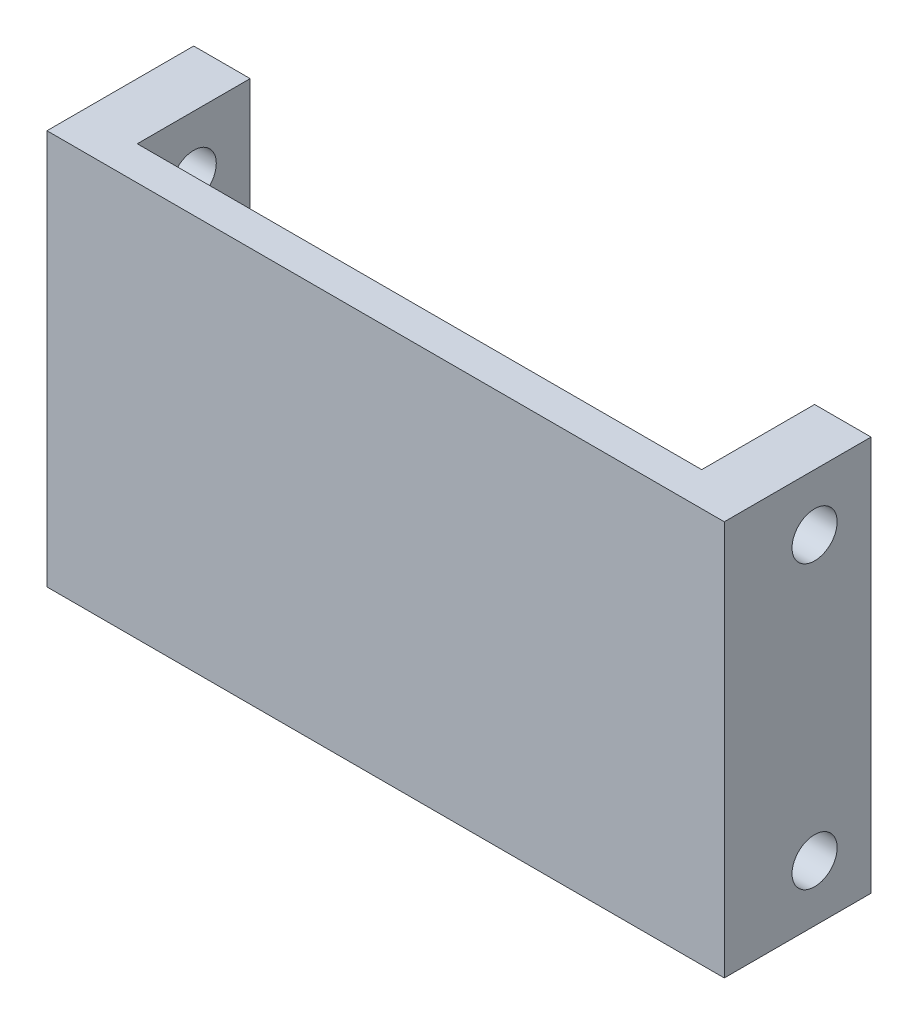
ISO-10303-21;
HEADER;
FILE_DESCRIPTION(('STEP AP214'),'2;1');
FILE_NAME('part.step','',(''),(''),'','','');
FILE_SCHEMA(('AUTOMOTIVE_DESIGN { 1 0 10303 214 1 1 1 1 }'));
ENDSEC;
DATA;
#1=APPLICATION_CONTEXT('core data for automotive mechanical design processes');
#2=APPLICATION_PROTOCOL_DEFINITION('international standard','automotive_design',2000,#1);
#3=PRODUCT_CONTEXT('',#1,'mechanical');
#4=PRODUCT('Part','Part','',(#3));
#5=PRODUCT_RELATED_PRODUCT_CATEGORY('part','',(#4));
#6=PRODUCT_DEFINITION_FORMATION('','',#4);
#7=PRODUCT_DEFINITION_CONTEXT('part definition',#1,'design');
#8=PRODUCT_DEFINITION('design','',#6,#7);
#9=PRODUCT_DEFINITION_SHAPE('','',#8);
#10=(LENGTH_UNIT() NAMED_UNIT(*) SI_UNIT(.MILLI.,.METRE.));
#11=(NAMED_UNIT(*) PLANE_ANGLE_UNIT() SI_UNIT($,.RADIAN.));
#12=(NAMED_UNIT(*) SI_UNIT($,.STERADIAN.) SOLID_ANGLE_UNIT());
#13=UNCERTAINTY_MEASURE_WITH_UNIT(LENGTH_MEASURE(1.E-05),#10,'distance_accuracy_value','');
#14=(GEOMETRIC_REPRESENTATION_CONTEXT(3) GLOBAL_UNCERTAINTY_ASSIGNED_CONTEXT((#13)) GLOBAL_UNIT_ASSIGNED_CONTEXT((#10,
#11,#12)) REPRESENTATION_CONTEXT('',''));
#15=CARTESIAN_POINT('',(0.,0.,0.));
#16=DIRECTION('',(0.,0.,1.));
#17=DIRECTION('',(1.,0.,0.));
#18=AXIS2_PLACEMENT_3D('',#15,#16,#17);
#19=CARTESIAN_POINT('',(0.,0.,0.));
#20=DIRECTION('',(0.,0.,1.));
#21=DIRECTION('',(1.,0.,0.));
#22=AXIS2_PLACEMENT_3D('',#19,#20,#21);
#23=PLANE('',#22);
#24=DIRECTION('',(0.,-1.,0.));
#25=VECTOR('',#24,1.);
#26=CARTESIAN_POINT('',(-25.,0.,0.));
#27=LINE('',#26,#25);
#28=CARTESIAN_POINT('',(-25.,17.5,0.));
#29=VERTEX_POINT('',#28);
#30=CARTESIAN_POINT('',(-25.,-17.5,0.));
#31=VERTEX_POINT('',#30);
#32=EDGE_CURVE('E122',#29,#31,#27,.T.);
#33=ORIENTED_EDGE('',*,*,#32,.F.);
#34=DIRECTION('',(-1.,0.,0.));
#35=VECTOR('',#34,1.);
#36=CARTESIAN_POINT('',(-30.,17.5,0.));
#37=LINE('',#36,#35);
#38=CARTESIAN_POINT('',(25.,17.5,0.));
#39=VERTEX_POINT('',#38);
#40=EDGE_CURVE('E127',#39,#29,#37,.T.);
#41=ORIENTED_EDGE('',*,*,#40,.F.);
#42=DIRECTION('',(0.,-1.,0.));
#43=VECTOR('',#42,1.);
#44=CARTESIAN_POINT('',(25.,0.,0.));
#45=LINE('',#44,#43);
#46=CARTESIAN_POINT('',(25.,-17.5,0.));
#47=VERTEX_POINT('',#46);
#48=EDGE_CURVE('E128',#39,#47,#45,.T.);
#49=ORIENTED_EDGE('',*,*,#48,.T.);
#50=DIRECTION('',(1.,0.,0.));
#51=VECTOR('',#50,1.);
#52=CARTESIAN_POINT('',(-30.,-17.5,0.));
#53=LINE('',#52,#51);
#54=EDGE_CURVE('E52',#31,#47,#53,.T.);
#55=ORIENTED_EDGE('',*,*,#54,.F.);
#56=EDGE_LOOP('',(#33,#41,#49,#55));
#57=FACE_BOUND('',#56,.T.);
#58=ADVANCED_FACE('F35',(#57),#23,.F.);
#59=CARTESIAN_POINT('',(-30.,17.5,3.));
#60=DIRECTION('',(1.,0.,0.));
#61=DIRECTION('',(0.,0.,-1.));
#62=AXIS2_PLACEMENT_3D('',#59,#60,#61);
#63=PLANE('',#62);
#64=CARTESIAN_POINT('',(-30.,12.5,-5.));
#65=DIRECTION('',(1.,0.,0.));
#66=DIRECTION('',(0.,0.,-1.));
#67=AXIS2_PLACEMENT_3D('',#64,#65,#66);
#68=CIRCLE('',#67,2.);
#69=CARTESIAN_POINT('',(-30.,12.5,-7.));
#70=VERTEX_POINT('',#69);
#71=EDGE_CURVE('E166',#70,#70,#68,.T.);
#72=ORIENTED_EDGE('',*,*,#71,.T.);
#73=EDGE_LOOP('',(#72));
#74=FACE_BOUND('',#73,.T.);
#75=CARTESIAN_POINT('',(-30.,-12.5,-5.));
#76=DIRECTION('',(1.,0.,0.));
#77=DIRECTION('',(0.,0.,-1.));
#78=AXIS2_PLACEMENT_3D('',#75,#76,#77);
#79=CIRCLE('',#78,2.);
#80=CARTESIAN_POINT('',(-30.,-12.5,-7.));
#81=VERTEX_POINT('',#80);
#82=EDGE_CURVE('E177',#81,#81,#79,.T.);
#83=ORIENTED_EDGE('',*,*,#82,.T.);
#84=EDGE_LOOP('',(#83));
#85=FACE_BOUND('',#84,.T.);
#86=DIRECTION('',(0.,0.,-1.));
#87=VECTOR('',#86,1.);
#88=CARTESIAN_POINT('',(-30.,17.5,3.));
#89=LINE('',#88,#87);
#90=CARTESIAN_POINT('',(-30.,17.5,3.));
#91=VERTEX_POINT('',#90);
#92=CARTESIAN_POINT('',(-30.,17.5,-10.));
#93=VERTEX_POINT('',#92);
#94=EDGE_CURVE('E157',#91,#93,#89,.T.);
#95=ORIENTED_EDGE('',*,*,#94,.T.);
#96=DIRECTION('',(0.,1.,0.));
#97=VECTOR('',#96,1.);
#98=CARTESIAN_POINT('',(-30.,0.,-10.));
#99=LINE('',#98,#97);
#100=CARTESIAN_POINT('',(-30.,-17.5,-10.));
#101=VERTEX_POINT('',#100);
#102=EDGE_CURVE('E120',#101,#93,#99,.T.);
#103=ORIENTED_EDGE('',*,*,#102,.F.);
#104=DIRECTION('',(0.,0.,-1.));
#105=VECTOR('',#104,1.);
#106=CARTESIAN_POINT('',(-30.,-17.5,3.));
#107=LINE('',#106,#105);
#108=CARTESIAN_POINT('',(-30.,-17.5,3.));
#109=VERTEX_POINT('',#108);
#110=EDGE_CURVE('E11',#109,#101,#107,.T.);
#111=ORIENTED_EDGE('',*,*,#110,.F.);
#112=DIRECTION('',(0.,-1.,0.));
#113=VECTOR('',#112,1.);
#114=CARTESIAN_POINT('',(-30.,17.5,3.));
#115=LINE('',#114,#113);
#116=EDGE_CURVE('E150',#91,#109,#115,.T.);
#117=ORIENTED_EDGE('',*,*,#116,.F.);
#118=EDGE_LOOP('',(#95,#103,#111,#117));
#119=FACE_BOUND('',#118,.T.);
#120=ADVANCED_FACE('F37',(#74,#85,#119),#63,.F.);
#121=CARTESIAN_POINT('',(-30.,-17.5,3.));
#122=DIRECTION('',(0.,1.,0.));
#123=DIRECTION('',(0.,0.,1.));
#124=AXIS2_PLACEMENT_3D('',#121,#122,#123);
#125=PLANE('',#124);
#126=ORIENTED_EDGE('',*,*,#110,.T.);
#127=DIRECTION('',(-1.,0.,0.));
#128=VECTOR('',#127,1.);
#129=CARTESIAN_POINT('',(0.,-17.5,-10.));
#130=LINE('',#129,#128);
#131=CARTESIAN_POINT('',(-25.,-17.5,-10.));
#132=VERTEX_POINT('',#131);
#133=EDGE_CURVE('E113',#132,#101,#130,.T.);
#134=ORIENTED_EDGE('',*,*,#133,.F.);
#135=DIRECTION('',(0.,0.,1.));
#136=VECTOR('',#135,1.);
#137=CARTESIAN_POINT('',(-25.,-17.5,-10.));
#138=LINE('',#137,#136);
#139=EDGE_CURVE('E109',#132,#31,#138,.T.);
#140=ORIENTED_EDGE('',*,*,#139,.T.);
#141=ORIENTED_EDGE('',*,*,#54,.T.);
#142=DIRECTION('',(0.,0.,1.));
#143=VECTOR('',#142,1.);
#144=CARTESIAN_POINT('',(25.,-17.5,-10.));
#145=LINE('',#144,#143);
#146=CARTESIAN_POINT('',(25.,-17.5,-10.));
#147=VERTEX_POINT('',#146);
#148=EDGE_CURVE('E145',#147,#47,#145,.T.);
#149=ORIENTED_EDGE('',*,*,#148,.F.);
#150=DIRECTION('',(-1.,0.,0.));
#151=VECTOR('',#150,1.);
#152=CARTESIAN_POINT('',(0.,-17.5,-10.));
#153=LINE('',#152,#151);
#154=CARTESIAN_POINT('',(30.,-17.5,-10.));
#155=VERTEX_POINT('',#154);
#156=EDGE_CURVE('E144',#155,#147,#153,.T.);
#157=ORIENTED_EDGE('',*,*,#156,.F.);
#158=DIRECTION('',(0.,0.,-1.));
#159=VECTOR('',#158,1.);
#160=CARTESIAN_POINT('',(30.,-17.5,3.));
#161=LINE('',#160,#159);
#162=CARTESIAN_POINT('',(30.,-17.5,3.));
#163=VERTEX_POINT('',#162);
#164=EDGE_CURVE('E44',#163,#155,#161,.T.);
#165=ORIENTED_EDGE('',*,*,#164,.F.);
#166=DIRECTION('',(1.,0.,0.));
#167=VECTOR('',#166,1.);
#168=CARTESIAN_POINT('',(-30.,-17.5,3.));
#169=LINE('',#168,#167);
#170=EDGE_CURVE('E152',#109,#163,#169,.T.);
#171=ORIENTED_EDGE('',*,*,#170,.F.);
#172=EDGE_LOOP('',(#126,#134,#140,#141,#149,#157,#165,#171));
#173=FACE_BOUND('',#172,.T.);
#174=ADVANCED_FACE('F190',(#173),#125,.F.);
#175=CARTESIAN_POINT('',(30.,17.5,3.));
#176=DIRECTION('',(-1.,0.,0.));
#177=DIRECTION('',(0.,0.,1.));
#178=AXIS2_PLACEMENT_3D('',#175,#176,#177);
#179=PLANE('',#178);
#180=CARTESIAN_POINT('',(30.,12.5,-5.));
#181=DIRECTION('',(1.,0.,0.));
#182=DIRECTION('',(0.,0.,-1.));
#183=AXIS2_PLACEMENT_3D('',#180,#181,#182);
#184=CIRCLE('',#183,2.);
#185=CARTESIAN_POINT('',(30.,12.5,-7.));
#186=VERTEX_POINT('',#185);
#187=EDGE_CURVE('E172',#186,#186,#184,.T.);
#188=ORIENTED_EDGE('',*,*,#187,.F.);
#189=EDGE_LOOP('',(#188));
#190=FACE_BOUND('',#189,.T.);
#191=CARTESIAN_POINT('',(30.,-12.5,-5.));
#192=DIRECTION('',(1.,0.,0.));
#193=DIRECTION('',(0.,0.,-1.));
#194=AXIS2_PLACEMENT_3D('',#191,#192,#193);
#195=CIRCLE('',#194,2.);
#196=CARTESIAN_POINT('',(30.,-12.5,-7.));
#197=VERTEX_POINT('',#196);
#198=EDGE_CURVE('E182',#197,#197,#195,.T.);
#199=ORIENTED_EDGE('',*,*,#198,.F.);
#200=EDGE_LOOP('',(#199));
#201=FACE_BOUND('',#200,.T.);
#202=ORIENTED_EDGE('',*,*,#164,.T.);
#203=DIRECTION('',(0.,-1.,0.));
#204=VECTOR('',#203,1.);
#205=CARTESIAN_POINT('',(30.,0.,-10.));
#206=LINE('',#205,#204);
#207=CARTESIAN_POINT('',(30.,17.5,-10.));
#208=VERTEX_POINT('',#207);
#209=EDGE_CURVE('E141',#208,#155,#206,.T.);
#210=ORIENTED_EDGE('',*,*,#209,.F.);
#211=DIRECTION('',(0.,0.,-1.));
#212=VECTOR('',#211,1.);
#213=CARTESIAN_POINT('',(30.,17.5,3.));
#214=LINE('',#213,#212);
#215=CARTESIAN_POINT('',(30.,17.5,3.));
#216=VERTEX_POINT('',#215);
#217=EDGE_CURVE('E161',#216,#208,#214,.T.);
#218=ORIENTED_EDGE('',*,*,#217,.F.);
#219=DIRECTION('',(0.,1.,0.));
#220=VECTOR('',#219,1.);
#221=CARTESIAN_POINT('',(30.,17.5,3.));
#222=LINE('',#221,#220);
#223=EDGE_CURVE('E154',#163,#216,#222,.T.);
#224=ORIENTED_EDGE('',*,*,#223,.F.);
#225=EDGE_LOOP('',(#202,#210,#218,#224));
#226=FACE_BOUND('',#225,.T.);
#227=ADVANCED_FACE('F204',(#190,#201,#226),#179,.F.);
#228=CARTESIAN_POINT('',(-30.,17.5,3.));
#229=DIRECTION('',(0.,-1.,0.));
#230=DIRECTION('',(0.,0.,-1.));
#231=AXIS2_PLACEMENT_3D('',#228,#229,#230);
#232=PLANE('',#231);
#233=ORIENTED_EDGE('',*,*,#217,.T.);
#234=DIRECTION('',(1.,0.,0.));
#235=VECTOR('',#234,1.);
#236=CARTESIAN_POINT('',(0.,17.5,-10.));
#237=LINE('',#236,#235);
#238=CARTESIAN_POINT('',(25.,17.5,-10.));
#239=VERTEX_POINT('',#238);
#240=EDGE_CURVE('E138',#239,#208,#237,.T.);
#241=ORIENTED_EDGE('',*,*,#240,.F.);
#242=DIRECTION('',(0.,0.,1.));
#243=VECTOR('',#242,1.);
#244=CARTESIAN_POINT('',(25.,17.5,-10.));
#245=LINE('',#244,#243);
#246=EDGE_CURVE('E148',#239,#39,#245,.T.);
#247=ORIENTED_EDGE('',*,*,#246,.T.);
#248=ORIENTED_EDGE('',*,*,#40,.T.);
#249=DIRECTION('',(0.,0.,1.));
#250=VECTOR('',#249,1.);
#251=CARTESIAN_POINT('',(-25.,17.5,-10.));
#252=LINE('',#251,#250);
#253=CARTESIAN_POINT('',(-25.,17.5,-10.));
#254=VERTEX_POINT('',#253);
#255=EDGE_CURVE('E107',#254,#29,#252,.T.);
#256=ORIENTED_EDGE('',*,*,#255,.F.);
#257=DIRECTION('',(1.,0.,0.));
#258=VECTOR('',#257,1.);
#259=CARTESIAN_POINT('',(0.,17.5,-10.));
#260=LINE('',#259,#258);
#261=EDGE_CURVE('E114',#93,#254,#260,.T.);
#262=ORIENTED_EDGE('',*,*,#261,.F.);
#263=ORIENTED_EDGE('',*,*,#94,.F.);
#264=DIRECTION('',(-1.,0.,0.));
#265=VECTOR('',#264,1.);
#266=CARTESIAN_POINT('',(-30.,17.5,3.));
#267=LINE('',#266,#265);
#268=EDGE_CURVE('E60',#216,#91,#267,.T.);
#269=ORIENTED_EDGE('',*,*,#268,.F.);
#270=EDGE_LOOP('',(#233,#241,#247,#248,#256,#262,#263,#269));
#271=FACE_BOUND('',#270,.T.);
#272=ADVANCED_FACE('F125',(#271),#232,.F.);
#273=CARTESIAN_POINT('',(0.,0.,3.));
#274=DIRECTION('',(0.,0.,1.));
#275=DIRECTION('',(1.,0.,0.));
#276=AXIS2_PLACEMENT_3D('',#273,#274,#275);
#277=PLANE('',#276);
#278=ORIENTED_EDGE('',*,*,#116,.T.);
#279=ORIENTED_EDGE('',*,*,#170,.T.);
#280=ORIENTED_EDGE('',*,*,#223,.T.);
#281=ORIENTED_EDGE('',*,*,#268,.T.);
#282=EDGE_LOOP('',(#278,#279,#280,#281));
#283=FACE_BOUND('',#282,.T.);
#284=ADVANCED_FACE('F205',(#283),#277,.T.);
#285=CARTESIAN_POINT('',(25.,0.,-10.));
#286=DIRECTION('',(-1.,0.,0.));
#287=DIRECTION('',(0.,-1.,0.));
#288=AXIS2_PLACEMENT_3D('',#285,#286,#287);
#289=PLANE('',#288);
#290=CARTESIAN_POINT('',(25.,12.5,-5.));
#291=DIRECTION('',(-1.,0.,0.));
#292=DIRECTION('',(0.,-1.,0.));
#293=AXIS2_PLACEMENT_3D('',#290,#291,#292);
#294=CIRCLE('',#293,2.);
#295=CARTESIAN_POINT('',(25.,10.5,-5.));
#296=VERTEX_POINT('',#295);
#297=EDGE_CURVE('E185',#296,#296,#294,.T.);
#298=ORIENTED_EDGE('',*,*,#297,.F.);
#299=EDGE_LOOP('',(#298));
#300=FACE_BOUND('',#299,.T.);
#301=CARTESIAN_POINT('',(25.,-12.5,-5.));
#302=DIRECTION('',(-1.,0.,0.));
#303=DIRECTION('',(0.,-1.,0.));
#304=AXIS2_PLACEMENT_3D('',#301,#302,#303);
#305=CIRCLE('',#304,2.);
#306=CARTESIAN_POINT('',(25.,-14.5,-5.));
#307=VERTEX_POINT('',#306);
#308=EDGE_CURVE('E165',#307,#307,#305,.T.);
#309=ORIENTED_EDGE('',*,*,#308,.F.);
#310=EDGE_LOOP('',(#309));
#311=FACE_BOUND('',#310,.T.);
#312=ORIENTED_EDGE('',*,*,#48,.F.);
#313=ORIENTED_EDGE('',*,*,#246,.F.);
#314=DIRECTION('',(0.,-1.,0.));
#315=VECTOR('',#314,1.);
#316=CARTESIAN_POINT('',(25.,0.,-10.));
#317=LINE('',#316,#315);
#318=EDGE_CURVE('E131',#239,#147,#317,.T.);
#319=ORIENTED_EDGE('',*,*,#318,.T.);
#320=ORIENTED_EDGE('',*,*,#148,.T.);
#321=EDGE_LOOP('',(#312,#313,#319,#320));
#322=FACE_BOUND('',#321,.T.);
#323=ADVANCED_FACE('F193',(#300,#311,#322),#289,.T.);
#324=CARTESIAN_POINT('',(0.,0.,-10.));
#325=DIRECTION('',(0.,0.,-1.));
#326=DIRECTION('',(-1.,0.,0.));
#327=AXIS2_PLACEMENT_3D('',#324,#325,#326);
#328=PLANE('',#327);
#329=ORIENTED_EDGE('',*,*,#318,.F.);
#330=ORIENTED_EDGE('',*,*,#240,.T.);
#331=ORIENTED_EDGE('',*,*,#209,.T.);
#332=ORIENTED_EDGE('',*,*,#156,.T.);
#333=EDGE_LOOP('',(#329,#330,#331,#332));
#334=FACE_BOUND('',#333,.T.);
#335=ADVANCED_FACE('F200',(#334),#328,.T.);
#336=CARTESIAN_POINT('',(-25.,0.,-10.));
#337=DIRECTION('',(-1.,0.,0.));
#338=DIRECTION('',(0.,-1.,0.));
#339=AXIS2_PLACEMENT_3D('',#336,#337,#338);
#340=PLANE('',#339);
#341=CARTESIAN_POINT('',(-25.,12.5,-5.));
#342=DIRECTION('',(-1.,0.,0.));
#343=DIRECTION('',(0.,-1.,0.));
#344=AXIS2_PLACEMENT_3D('',#341,#342,#343);
#345=CIRCLE('',#344,2.);
#346=CARTESIAN_POINT('',(-25.,10.5,-5.));
#347=VERTEX_POINT('',#346);
#348=EDGE_CURVE('E39',#347,#347,#345,.T.);
#349=ORIENTED_EDGE('',*,*,#348,.T.);
#350=EDGE_LOOP('',(#349));
#351=FACE_BOUND('',#350,.T.);
#352=CARTESIAN_POINT('',(-25.,-12.5,-5.));
#353=DIRECTION('',(-1.,0.,0.));
#354=DIRECTION('',(0.,-1.,0.));
#355=AXIS2_PLACEMENT_3D('',#352,#353,#354);
#356=CIRCLE('',#355,2.);
#357=CARTESIAN_POINT('',(-25.,-14.5,-5.));
#358=VERTEX_POINT('',#357);
#359=EDGE_CURVE('E163',#358,#358,#356,.T.);
#360=ORIENTED_EDGE('',*,*,#359,.T.);
#361=EDGE_LOOP('',(#360));
#362=FACE_BOUND('',#361,.T.);
#363=ORIENTED_EDGE('',*,*,#32,.T.);
#364=ORIENTED_EDGE('',*,*,#139,.F.);
#365=DIRECTION('',(0.,-1.,0.));
#366=VECTOR('',#365,1.);
#367=CARTESIAN_POINT('',(-25.,0.,-10.));
#368=LINE('',#367,#366);
#369=EDGE_CURVE('E103',#254,#132,#368,.T.);
#370=ORIENTED_EDGE('',*,*,#369,.F.);
#371=ORIENTED_EDGE('',*,*,#255,.T.);
#372=EDGE_LOOP('',(#363,#364,#370,#371));
#373=FACE_BOUND('',#372,.T.);
#374=ADVANCED_FACE('F105',(#351,#362,#373),#340,.F.);
#375=CARTESIAN_POINT('',(0.,0.,-10.));
#376=DIRECTION('',(0.,0.,-1.));
#377=DIRECTION('',(-1.,0.,0.));
#378=AXIS2_PLACEMENT_3D('',#375,#376,#377);
#379=PLANE('',#378);
#380=ORIENTED_EDGE('',*,*,#261,.T.);
#381=ORIENTED_EDGE('',*,*,#369,.T.);
#382=ORIENTED_EDGE('',*,*,#133,.T.);
#383=ORIENTED_EDGE('',*,*,#102,.T.);
#384=EDGE_LOOP('',(#380,#381,#382,#383));
#385=FACE_BOUND('',#384,.T.);
#386=ADVANCED_FACE('F118',(#385),#379,.T.);
#387=CARTESIAN_POINT('',(-30.,-12.5,-5.));
#388=DIRECTION('',(1.,0.,0.));
#389=DIRECTION('',(0.,0.,-1.));
#390=AXIS2_PLACEMENT_3D('',#387,#388,#389);
#391=CYLINDRICAL_SURFACE('',#390,2.);
#392=ORIENTED_EDGE('',*,*,#82,.F.);
#393=EDGE_LOOP('',(#392));
#394=FACE_BOUND('',#393,.T.);
#395=ORIENTED_EDGE('',*,*,#359,.F.);
#396=EDGE_LOOP('',(#395));
#397=FACE_BOUND('',#396,.T.);
#398=ADVANCED_FACE('F218',(#394,#397),#391,.F.);
#399=CARTESIAN_POINT('',(-30.,12.5,-5.));
#400=DIRECTION('',(1.,0.,0.));
#401=DIRECTION('',(0.,0.,-1.));
#402=AXIS2_PLACEMENT_3D('',#399,#400,#401);
#403=CYLINDRICAL_SURFACE('',#402,2.);
#404=ORIENTED_EDGE('',*,*,#71,.F.);
#405=EDGE_LOOP('',(#404));
#406=FACE_BOUND('',#405,.T.);
#407=ORIENTED_EDGE('',*,*,#348,.F.);
#408=EDGE_LOOP('',(#407));
#409=FACE_BOUND('',#408,.T.);
#410=ADVANCED_FACE('F221',(#406,#409),#403,.F.);
#411=ORIENTED_EDGE('',*,*,#308,.T.);
#412=EDGE_LOOP('',(#411));
#413=FACE_BOUND('',#412,.T.);
#414=ORIENTED_EDGE('',*,*,#198,.T.);
#415=EDGE_LOOP('',(#414));
#416=FACE_BOUND('',#415,.T.);
#417=ADVANCED_FACE('F223',(#413,#416),#391,.F.);
#418=ORIENTED_EDGE('',*,*,#297,.T.);
#419=EDGE_LOOP('',(#418));
#420=FACE_BOUND('',#419,.T.);
#421=ORIENTED_EDGE('',*,*,#187,.T.);
#422=EDGE_LOOP('',(#421));
#423=FACE_BOUND('',#422,.T.);
#424=ADVANCED_FACE('F230',(#420,#423),#403,.F.);
#425=CLOSED_SHELL('',(#58,#120,#174,#227,#272,#284,#323,#335,#374,#386,#398,#410,#417,#424));
#426=MANIFOLD_SOLID_BREP('B2',#425);
#427=ADVANCED_BREP_SHAPE_REPRESENTATION('',(#18,#426),#14);
#428=SHAPE_DEFINITION_REPRESENTATION(#9,#427);
ENDSEC;
END-ISO-10303-21;
